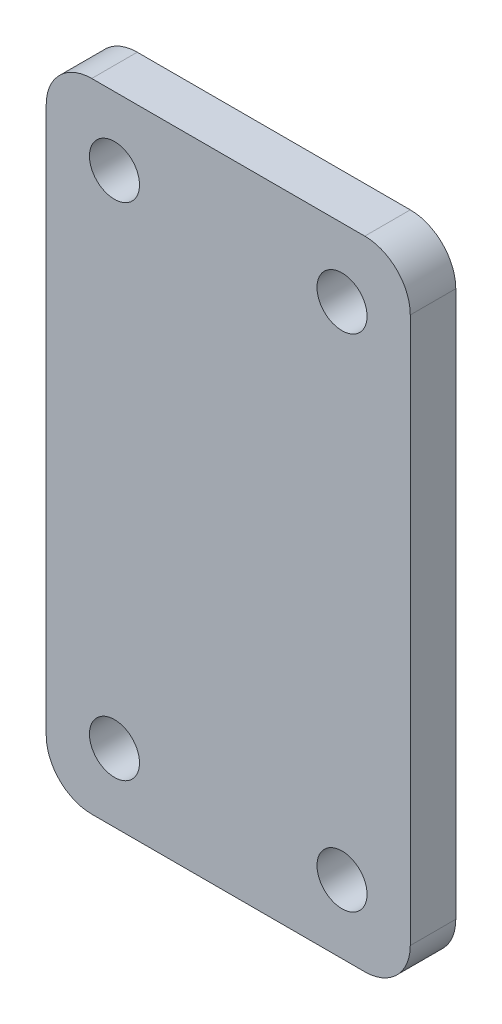
ISO-10303-21;
HEADER;
FILE_DESCRIPTION(('STEP AP214'),'2;1');
FILE_NAME('part.step','',(''),(''),'','','');
FILE_SCHEMA(('AUTOMOTIVE_DESIGN { 1 0 10303 214 1 1 1 1 }'));
ENDSEC;
DATA;
#1=APPLICATION_CONTEXT('core data for automotive mechanical design processes');
#2=APPLICATION_PROTOCOL_DEFINITION('international standard','automotive_design',2000,#1);
#3=PRODUCT_CONTEXT('',#1,'mechanical');
#4=PRODUCT('Part','Part','',(#3));
#5=PRODUCT_RELATED_PRODUCT_CATEGORY('part','',(#4));
#6=PRODUCT_DEFINITION_FORMATION('','',#4);
#7=PRODUCT_DEFINITION_CONTEXT('part definition',#1,'design');
#8=PRODUCT_DEFINITION('design','',#6,#7);
#9=PRODUCT_DEFINITION_SHAPE('','',#8);
#10=(LENGTH_UNIT() NAMED_UNIT(*) SI_UNIT(.MILLI.,.METRE.));
#11=(NAMED_UNIT(*) PLANE_ANGLE_UNIT() SI_UNIT($,.RADIAN.));
#12=(NAMED_UNIT(*) SI_UNIT($,.STERADIAN.) SOLID_ANGLE_UNIT());
#13=UNCERTAINTY_MEASURE_WITH_UNIT(LENGTH_MEASURE(1.E-05),#10,'distance_accuracy_value','');
#14=(GEOMETRIC_REPRESENTATION_CONTEXT(3) GLOBAL_UNCERTAINTY_ASSIGNED_CONTEXT((#13)) GLOBAL_UNIT_ASSIGNED_CONTEXT((#10,
#11,#12)) REPRESENTATION_CONTEXT('',''));
#15=CARTESIAN_POINT('',(0.,0.,0.));
#16=DIRECTION('',(0.,0.,1.));
#17=DIRECTION('',(1.,0.,0.));
#18=AXIS2_PLACEMENT_3D('',#15,#16,#17);
#19=CARTESIAN_POINT('',(40.,70.,-10.));
#20=DIRECTION('',(1.,0.,0.));
#21=DIRECTION('',(0.,1.,0.));
#22=AXIS2_PLACEMENT_3D('',#19,#20,#21);
#23=PLANE('',#22);
#24=DIRECTION('',(0.,1.,0.));
#25=VECTOR('',#24,1.);
#26=CARTESIAN_POINT('',(40.,70.,-10.));
#27=LINE('',#26,#25);
#28=CARTESIAN_POINT('',(40.,-60.,-10.));
#29=VERTEX_POINT('',#28);
#30=CARTESIAN_POINT('',(40.,60.,-10.));
#31=VERTEX_POINT('',#30);
#32=EDGE_CURVE('E196',#29,#31,#27,.T.);
#33=ORIENTED_EDGE('',*,*,#32,.T.);
#34=DIRECTION('',(0.,0.,1.));
#35=VECTOR('',#34,1.);
#36=CARTESIAN_POINT('',(40.,60.,-10.));
#37=LINE('',#36,#35);
#38=CARTESIAN_POINT('',(40.,60.,0.));
#39=VERTEX_POINT('',#38);
#40=EDGE_CURVE('E175',#31,#39,#37,.T.);
#41=ORIENTED_EDGE('',*,*,#40,.T.);
#42=DIRECTION('',(0.,1.,0.));
#43=VECTOR('',#42,1.);
#44=CARTESIAN_POINT('',(40.,70.,0.));
#45=LINE('',#44,#43);
#46=CARTESIAN_POINT('',(40.,-60.,0.));
#47=VERTEX_POINT('',#46);
#48=EDGE_CURVE('E112',#47,#39,#45,.T.);
#49=ORIENTED_EDGE('',*,*,#48,.F.);
#50=DIRECTION('',(0.,0.,1.));
#51=VECTOR('',#50,1.);
#52=CARTESIAN_POINT('',(40.,-60.,-10.));
#53=LINE('',#52,#51);
#54=EDGE_CURVE('E172',#47,#29,#53,.F.);
#55=ORIENTED_EDGE('',*,*,#54,.T.);
#56=EDGE_LOOP('',(#33,#41,#49,#55));
#57=FACE_BOUND('',#56,.T.);
#58=ADVANCED_FACE('F40',(#57),#23,.T.);
#59=CARTESIAN_POINT('',(-40.,-70.,-10.));
#60=DIRECTION('',(0.,-1.,0.));
#61=DIRECTION('',(0.,0.,-1.));
#62=AXIS2_PLACEMENT_3D('',#59,#60,#61);
#63=PLANE('',#62);
#64=DIRECTION('',(1.,0.,0.));
#65=VECTOR('',#64,1.);
#66=CARTESIAN_POINT('',(-40.,-70.,-10.));
#67=LINE('',#66,#65);
#68=CARTESIAN_POINT('',(-30.,-70.,-10.));
#69=VERTEX_POINT('',#68);
#70=CARTESIAN_POINT('',(30.,-70.,-10.));
#71=VERTEX_POINT('',#70);
#72=EDGE_CURVE('E136',#69,#71,#67,.T.);
#73=ORIENTED_EDGE('',*,*,#72,.T.);
#74=DIRECTION('',(0.,0.,1.));
#75=VECTOR('',#74,1.);
#76=CARTESIAN_POINT('',(30.,-70.,-10.));
#77=LINE('',#76,#75);
#78=CARTESIAN_POINT('',(30.,-70.,0.));
#79=VERTEX_POINT('',#78);
#80=EDGE_CURVE('E11',#71,#79,#77,.T.);
#81=ORIENTED_EDGE('',*,*,#80,.T.);
#82=DIRECTION('',(1.,0.,0.));
#83=VECTOR('',#82,1.);
#84=CARTESIAN_POINT('',(-40.,-70.,0.));
#85=LINE('',#84,#83);
#86=CARTESIAN_POINT('',(-30.,-70.,0.));
#87=VERTEX_POINT('',#86);
#88=EDGE_CURVE('E146',#87,#79,#85,.T.);
#89=ORIENTED_EDGE('',*,*,#88,.F.);
#90=DIRECTION('',(0.,0.,1.));
#91=VECTOR('',#90,1.);
#92=CARTESIAN_POINT('',(-30.,-70.,-10.));
#93=LINE('',#92,#91);
#94=EDGE_CURVE('E49',#87,#69,#93,.F.);
#95=ORIENTED_EDGE('',*,*,#94,.T.);
#96=EDGE_LOOP('',(#73,#81,#89,#95));
#97=FACE_BOUND('',#96,.T.);
#98=ADVANCED_FACE('F240',(#97),#63,.T.);
#99=CARTESIAN_POINT('',(-40.,70.,-10.));
#100=DIRECTION('',(-1.,0.,0.));
#101=DIRECTION('',(0.,-1.,0.));
#102=AXIS2_PLACEMENT_3D('',#99,#100,#101);
#103=PLANE('',#102);
#104=DIRECTION('',(0.,-1.,0.));
#105=VECTOR('',#104,1.);
#106=CARTESIAN_POINT('',(-40.,70.,0.));
#107=LINE('',#106,#105);
#108=CARTESIAN_POINT('',(-40.,60.,0.));
#109=VERTEX_POINT('',#108);
#110=CARTESIAN_POINT('',(-40.,-60.,0.));
#111=VERTEX_POINT('',#110);
#112=EDGE_CURVE('E130',#109,#111,#107,.T.);
#113=ORIENTED_EDGE('',*,*,#112,.F.);
#114=DIRECTION('',(0.,0.,1.));
#115=VECTOR('',#114,1.);
#116=CARTESIAN_POINT('',(-40.,60.,-10.));
#117=LINE('',#116,#115);
#118=CARTESIAN_POINT('',(-40.,60.,-10.));
#119=VERTEX_POINT('',#118);
#120=EDGE_CURVE('E159',#109,#119,#117,.F.);
#121=ORIENTED_EDGE('',*,*,#120,.T.);
#122=DIRECTION('',(0.,-1.,0.));
#123=VECTOR('',#122,1.);
#124=CARTESIAN_POINT('',(-40.,70.,-10.));
#125=LINE('',#124,#123);
#126=CARTESIAN_POINT('',(-40.,-60.,-10.));
#127=VERTEX_POINT('',#126);
#128=EDGE_CURVE('E143',#119,#127,#125,.T.);
#129=ORIENTED_EDGE('',*,*,#128,.T.);
#130=DIRECTION('',(0.,0.,1.));
#131=VECTOR('',#130,1.);
#132=CARTESIAN_POINT('',(-40.,-60.,-10.));
#133=LINE('',#132,#131);
#134=EDGE_CURVE('E155',#127,#111,#133,.T.);
#135=ORIENTED_EDGE('',*,*,#134,.T.);
#136=EDGE_LOOP('',(#113,#121,#129,#135));
#137=FACE_BOUND('',#136,.T.);
#138=ADVANCED_FACE('F219',(#137),#103,.T.);
#139=CARTESIAN_POINT('',(-40.,70.,-10.));
#140=DIRECTION('',(0.,1.,0.));
#141=DIRECTION('',(0.,0.,1.));
#142=AXIS2_PLACEMENT_3D('',#139,#140,#141);
#143=PLANE('',#142);
#144=DIRECTION('',(-1.,0.,0.));
#145=VECTOR('',#144,1.);
#146=CARTESIAN_POINT('',(-40.,70.,-10.));
#147=LINE('',#146,#145);
#148=CARTESIAN_POINT('',(30.,70.,-10.));
#149=VERTEX_POINT('',#148);
#150=CARTESIAN_POINT('',(-30.,70.,-10.));
#151=VERTEX_POINT('',#150);
#152=EDGE_CURVE('E198',#149,#151,#147,.T.);
#153=ORIENTED_EDGE('',*,*,#152,.T.);
#154=DIRECTION('',(0.,0.,1.));
#155=VECTOR('',#154,1.);
#156=CARTESIAN_POINT('',(-30.,70.,-10.));
#157=LINE('',#156,#155);
#158=CARTESIAN_POINT('',(-30.,70.,0.));
#159=VERTEX_POINT('',#158);
#160=EDGE_CURVE('E128',#151,#159,#157,.T.);
#161=ORIENTED_EDGE('',*,*,#160,.T.);
#162=DIRECTION('',(-1.,0.,0.));
#163=VECTOR('',#162,1.);
#164=CARTESIAN_POINT('',(-40.,70.,0.));
#165=LINE('',#164,#163);
#166=CARTESIAN_POINT('',(30.,70.,0.));
#167=VERTEX_POINT('',#166);
#168=EDGE_CURVE('E110',#167,#159,#165,.T.);
#169=ORIENTED_EDGE('',*,*,#168,.F.);
#170=DIRECTION('',(0.,0.,1.));
#171=VECTOR('',#170,1.);
#172=CARTESIAN_POINT('',(30.,70.,-10.));
#173=LINE('',#172,#171);
#174=EDGE_CURVE('E125',#167,#149,#173,.F.);
#175=ORIENTED_EDGE('',*,*,#174,.T.);
#176=EDGE_LOOP('',(#153,#161,#169,#175));
#177=FACE_BOUND('',#176,.T.);
#178=ADVANCED_FACE('F124',(#177),#143,.T.);
#179=CARTESIAN_POINT('',(0.,0.,-10.));
#180=DIRECTION('',(0.,0.,1.));
#181=DIRECTION('',(1.,0.,0.));
#182=AXIS2_PLACEMENT_3D('',#179,#180,#181);
#183=PLANE('',#182);
#184=CARTESIAN_POINT('',(25.,-55.,-10.));
#185=DIRECTION('',(0.,0.,1.));
#186=DIRECTION('',(1.,0.,0.));
#187=AXIS2_PLACEMENT_3D('',#184,#185,#186);
#188=CIRCLE('',#187,5.5);
#189=CARTESIAN_POINT('',(30.5,-55.,-10.));
#190=VERTEX_POINT('',#189);
#191=EDGE_CURVE('E206',#190,#190,#188,.T.);
#192=ORIENTED_EDGE('',*,*,#191,.T.);
#193=EDGE_LOOP('',(#192));
#194=FACE_BOUND('',#193,.T.);
#195=CARTESIAN_POINT('',(-25.,-55.,-10.));
#196=DIRECTION('',(0.,0.,1.));
#197=DIRECTION('',(1.,0.,0.));
#198=AXIS2_PLACEMENT_3D('',#195,#196,#197);
#199=CIRCLE('',#198,5.5);
#200=CARTESIAN_POINT('',(-19.5,-55.,-10.));
#201=VERTEX_POINT('',#200);
#202=EDGE_CURVE('E397',#201,#201,#199,.T.);
#203=ORIENTED_EDGE('',*,*,#202,.T.);
#204=EDGE_LOOP('',(#203));
#205=FACE_BOUND('',#204,.T.);
#206=CARTESIAN_POINT('',(-25.,55.,-10.));
#207=DIRECTION('',(0.,0.,1.));
#208=DIRECTION('',(1.,0.,0.));
#209=AXIS2_PLACEMENT_3D('',#206,#207,#208);
#210=CIRCLE('',#209,5.5);
#211=CARTESIAN_POINT('',(-19.5,55.,-10.));
#212=VERTEX_POINT('',#211);
#213=EDGE_CURVE('E401',#212,#212,#210,.T.);
#214=ORIENTED_EDGE('',*,*,#213,.T.);
#215=EDGE_LOOP('',(#214));
#216=FACE_BOUND('',#215,.T.);
#217=CARTESIAN_POINT('',(25.,55.,-10.));
#218=DIRECTION('',(0.,0.,1.));
#219=DIRECTION('',(1.,0.,0.));
#220=AXIS2_PLACEMENT_3D('',#217,#218,#219);
#221=CIRCLE('',#220,5.5);
#222=CARTESIAN_POINT('',(30.5,55.,-10.));
#223=VERTEX_POINT('',#222);
#224=EDGE_CURVE('E404',#223,#223,#221,.T.);
#225=ORIENTED_EDGE('',*,*,#224,.T.);
#226=EDGE_LOOP('',(#225));
#227=FACE_BOUND('',#226,.T.);
#228=ORIENTED_EDGE('',*,*,#128,.F.);
#229=CARTESIAN_POINT('',(-30.,60.,-10.));
#230=DIRECTION('',(0.,0.,1.));
#231=DIRECTION('',(1.,0.,0.));
#232=AXIS2_PLACEMENT_3D('',#229,#230,#231);
#233=CIRCLE('',#232,10.);
#234=EDGE_CURVE('E169',#119,#151,#233,.F.);
#235=ORIENTED_EDGE('',*,*,#234,.T.);
#236=ORIENTED_EDGE('',*,*,#152,.F.);
#237=CARTESIAN_POINT('',(30.,60.,-10.));
#238=DIRECTION('',(0.,0.,1.));
#239=DIRECTION('',(1.,0.,0.));
#240=AXIS2_PLACEMENT_3D('',#237,#238,#239);
#241=CIRCLE('',#240,10.);
#242=EDGE_CURVE('E134',#149,#31,#241,.F.);
#243=ORIENTED_EDGE('',*,*,#242,.T.);
#244=ORIENTED_EDGE('',*,*,#32,.F.);
#245=CARTESIAN_POINT('',(30.,-60.,-10.));
#246=DIRECTION('',(0.,0.,1.));
#247=DIRECTION('',(1.,0.,0.));
#248=AXIS2_PLACEMENT_3D('',#245,#246,#247);
#249=CIRCLE('',#248,10.);
#250=EDGE_CURVE('E56',#29,#71,#249,.F.);
#251=ORIENTED_EDGE('',*,*,#250,.T.);
#252=ORIENTED_EDGE('',*,*,#72,.F.);
#253=CARTESIAN_POINT('',(-30.,-60.,-10.));
#254=DIRECTION('',(0.,0.,1.));
#255=DIRECTION('',(1.,0.,0.));
#256=AXIS2_PLACEMENT_3D('',#253,#254,#255);
#257=CIRCLE('',#256,10.);
#258=EDGE_CURVE('E162',#69,#127,#257,.F.);
#259=ORIENTED_EDGE('',*,*,#258,.T.);
#260=EDGE_LOOP('',(#228,#235,#236,#243,#244,#251,#252,#259));
#261=FACE_BOUND('',#260,.T.);
#262=ADVANCED_FACE('F225',(#194,#205,#216,#227,#261),#183,.F.);
#263=CARTESIAN_POINT('',(0.,0.,0.));
#264=DIRECTION('',(0.,0.,1.));
#265=DIRECTION('',(1.,0.,0.));
#266=AXIS2_PLACEMENT_3D('',#263,#264,#265);
#267=PLANE('',#266);
#268=CARTESIAN_POINT('',(25.,-55.,0.));
#269=DIRECTION('',(0.,0.,1.));
#270=DIRECTION('',(1.,0.,0.));
#271=AXIS2_PLACEMENT_3D('',#268,#269,#270);
#272=CIRCLE('',#271,5.5);
#273=CARTESIAN_POINT('',(30.5,-55.,0.));
#274=VERTEX_POINT('',#273);
#275=EDGE_CURVE('E424',#274,#274,#272,.T.);
#276=ORIENTED_EDGE('',*,*,#275,.F.);
#277=EDGE_LOOP('',(#276));
#278=FACE_BOUND('',#277,.T.);
#279=CARTESIAN_POINT('',(-25.,-55.,0.));
#280=DIRECTION('',(0.,0.,1.));
#281=DIRECTION('',(1.,0.,0.));
#282=AXIS2_PLACEMENT_3D('',#279,#280,#281);
#283=CIRCLE('',#282,5.5);
#284=CARTESIAN_POINT('',(-19.5,-55.,0.));
#285=VERTEX_POINT('',#284);
#286=EDGE_CURVE('E428',#285,#285,#283,.T.);
#287=ORIENTED_EDGE('',*,*,#286,.F.);
#288=EDGE_LOOP('',(#287));
#289=FACE_BOUND('',#288,.T.);
#290=CARTESIAN_POINT('',(-25.,55.,0.));
#291=DIRECTION('',(0.,0.,1.));
#292=DIRECTION('',(1.,0.,0.));
#293=AXIS2_PLACEMENT_3D('',#290,#291,#292);
#294=CIRCLE('',#293,5.5);
#295=CARTESIAN_POINT('',(-19.5,55.,0.));
#296=VERTEX_POINT('',#295);
#297=EDGE_CURVE('E414',#296,#296,#294,.T.);
#298=ORIENTED_EDGE('',*,*,#297,.F.);
#299=EDGE_LOOP('',(#298));
#300=FACE_BOUND('',#299,.T.);
#301=CARTESIAN_POINT('',(25.,55.,0.));
#302=DIRECTION('',(0.,0.,1.));
#303=DIRECTION('',(1.,0.,0.));
#304=AXIS2_PLACEMENT_3D('',#301,#302,#303);
#305=CIRCLE('',#304,5.5);
#306=CARTESIAN_POINT('',(30.5,55.,0.));
#307=VERTEX_POINT('',#306);
#308=EDGE_CURVE('E407',#307,#307,#305,.T.);
#309=ORIENTED_EDGE('',*,*,#308,.F.);
#310=EDGE_LOOP('',(#309));
#311=FACE_BOUND('',#310,.T.);
#312=ORIENTED_EDGE('',*,*,#168,.T.);
#313=CARTESIAN_POINT('',(-30.,60.,0.));
#314=DIRECTION('',(0.,0.,1.));
#315=DIRECTION('',(1.,0.,0.));
#316=AXIS2_PLACEMENT_3D('',#313,#314,#315);
#317=CIRCLE('',#316,10.);
#318=EDGE_CURVE('E118',#159,#109,#317,.T.);
#319=ORIENTED_EDGE('',*,*,#318,.T.);
#320=ORIENTED_EDGE('',*,*,#112,.T.);
#321=CARTESIAN_POINT('',(-30.,-60.,0.));
#322=DIRECTION('',(0.,0.,1.));
#323=DIRECTION('',(1.,0.,0.));
#324=AXIS2_PLACEMENT_3D('',#321,#322,#323);
#325=CIRCLE('',#324,10.);
#326=EDGE_CURVE('E141',#111,#87,#325,.T.);
#327=ORIENTED_EDGE('',*,*,#326,.T.);
#328=ORIENTED_EDGE('',*,*,#88,.T.);
#329=CARTESIAN_POINT('',(30.,-60.,0.));
#330=DIRECTION('',(0.,0.,1.));
#331=DIRECTION('',(1.,0.,0.));
#332=AXIS2_PLACEMENT_3D('',#329,#330,#331);
#333=CIRCLE('',#332,10.);
#334=EDGE_CURVE('E119',#79,#47,#333,.T.);
#335=ORIENTED_EDGE('',*,*,#334,.T.);
#336=ORIENTED_EDGE('',*,*,#48,.T.);
#337=CARTESIAN_POINT('',(30.,60.,0.));
#338=DIRECTION('',(0.,0.,1.));
#339=DIRECTION('',(1.,0.,0.));
#340=AXIS2_PLACEMENT_3D('',#337,#338,#339);
#341=CIRCLE('',#340,10.);
#342=EDGE_CURVE('E107',#39,#167,#341,.T.);
#343=ORIENTED_EDGE('',*,*,#342,.T.);
#344=EDGE_LOOP('',(#312,#319,#320,#327,#328,#335,#336,#343));
#345=FACE_BOUND('',#344,.T.);
#346=ADVANCED_FACE('F109',(#278,#289,#300,#311,#345),#267,.T.);
#347=CARTESIAN_POINT('',(-30.,60.,-10.));
#348=DIRECTION('',(0.,0.,1.));
#349=DIRECTION('',(1.,0.,0.));
#350=AXIS2_PLACEMENT_3D('',#347,#348,#349);
#351=CYLINDRICAL_SURFACE('',#350,10.);
#352=ORIENTED_EDGE('',*,*,#234,.F.);
#353=ORIENTED_EDGE('',*,*,#120,.F.);
#354=ORIENTED_EDGE('',*,*,#318,.F.);
#355=ORIENTED_EDGE('',*,*,#160,.F.);
#356=EDGE_LOOP('',(#352,#353,#354,#355));
#357=FACE_BOUND('',#356,.T.);
#358=ADVANCED_FACE('F224',(#357),#351,.T.);
#359=CARTESIAN_POINT('',(30.,60.,-10.));
#360=DIRECTION('',(0.,0.,1.));
#361=DIRECTION('',(1.,0.,0.));
#362=AXIS2_PLACEMENT_3D('',#359,#360,#361);
#363=CYLINDRICAL_SURFACE('',#362,10.);
#364=ORIENTED_EDGE('',*,*,#242,.F.);
#365=ORIENTED_EDGE('',*,*,#174,.F.);
#366=ORIENTED_EDGE('',*,*,#342,.F.);
#367=ORIENTED_EDGE('',*,*,#40,.F.);
#368=EDGE_LOOP('',(#364,#365,#366,#367));
#369=FACE_BOUND('',#368,.T.);
#370=ADVANCED_FACE('F133',(#369),#363,.T.);
#371=CARTESIAN_POINT('',(30.,-60.,-10.));
#372=DIRECTION('',(0.,0.,1.));
#373=DIRECTION('',(1.,0.,0.));
#374=AXIS2_PLACEMENT_3D('',#371,#372,#373);
#375=CYLINDRICAL_SURFACE('',#374,10.);
#376=ORIENTED_EDGE('',*,*,#250,.F.);
#377=ORIENTED_EDGE('',*,*,#54,.F.);
#378=ORIENTED_EDGE('',*,*,#334,.F.);
#379=ORIENTED_EDGE('',*,*,#80,.F.);
#380=EDGE_LOOP('',(#376,#377,#378,#379));
#381=FACE_BOUND('',#380,.T.);
#382=ADVANCED_FACE('F230',(#381),#375,.T.);
#383=CARTESIAN_POINT('',(-30.,-60.,-10.));
#384=DIRECTION('',(0.,0.,1.));
#385=DIRECTION('',(1.,0.,0.));
#386=AXIS2_PLACEMENT_3D('',#383,#384,#385);
#387=CYLINDRICAL_SURFACE('',#386,10.);
#388=ORIENTED_EDGE('',*,*,#258,.F.);
#389=ORIENTED_EDGE('',*,*,#94,.F.);
#390=ORIENTED_EDGE('',*,*,#326,.F.);
#391=ORIENTED_EDGE('',*,*,#134,.F.);
#392=EDGE_LOOP('',(#388,#389,#390,#391));
#393=FACE_BOUND('',#392,.T.);
#394=ADVANCED_FACE('F42',(#393),#387,.T.);
#395=CARTESIAN_POINT('',(25.,55.,-20.));
#396=DIRECTION('',(0.,0.,1.));
#397=DIRECTION('',(1.,0.,0.));
#398=AXIS2_PLACEMENT_3D('',#395,#396,#397);
#399=CYLINDRICAL_SURFACE('',#398,5.5);
#400=ORIENTED_EDGE('',*,*,#308,.T.);
#401=EDGE_LOOP('',(#400));
#402=FACE_BOUND('',#401,.T.);
#403=ORIENTED_EDGE('',*,*,#224,.F.);
#404=EDGE_LOOP('',(#403));
#405=FACE_BOUND('',#404,.T.);
#406=ADVANCED_FACE('F229',(#402,#405),#399,.F.);
#407=CARTESIAN_POINT('',(-25.,55.,-20.));
#408=DIRECTION('',(0.,0.,1.));
#409=DIRECTION('',(1.,0.,0.));
#410=AXIS2_PLACEMENT_3D('',#407,#408,#409);
#411=CYLINDRICAL_SURFACE('',#410,5.5);
#412=ORIENTED_EDGE('',*,*,#297,.T.);
#413=EDGE_LOOP('',(#412));
#414=FACE_BOUND('',#413,.T.);
#415=ORIENTED_EDGE('',*,*,#213,.F.);
#416=EDGE_LOOP('',(#415));
#417=FACE_BOUND('',#416,.T.);
#418=ADVANCED_FACE('F235',(#414,#417),#411,.F.);
#419=CARTESIAN_POINT('',(-25.,-55.,-20.));
#420=DIRECTION('',(0.,0.,1.));
#421=DIRECTION('',(1.,0.,0.));
#422=AXIS2_PLACEMENT_3D('',#419,#420,#421);
#423=CYLINDRICAL_SURFACE('',#422,5.5);
#424=ORIENTED_EDGE('',*,*,#286,.T.);
#425=EDGE_LOOP('',(#424));
#426=FACE_BOUND('',#425,.T.);
#427=ORIENTED_EDGE('',*,*,#202,.F.);
#428=EDGE_LOOP('',(#427));
#429=FACE_BOUND('',#428,.T.);
#430=ADVANCED_FACE('F280',(#426,#429),#423,.F.);
#431=CARTESIAN_POINT('',(25.,-55.,-20.));
#432=DIRECTION('',(0.,0.,1.));
#433=DIRECTION('',(1.,0.,0.));
#434=AXIS2_PLACEMENT_3D('',#431,#432,#433);
#435=CYLINDRICAL_SURFACE('',#434,5.5);
#436=ORIENTED_EDGE('',*,*,#275,.T.);
#437=EDGE_LOOP('',(#436));
#438=FACE_BOUND('',#437,.T.);
#439=ORIENTED_EDGE('',*,*,#191,.F.);
#440=EDGE_LOOP('',(#439));
#441=FACE_BOUND('',#440,.T.);
#442=ADVANCED_FACE('F290',(#438,#441),#435,.F.);
#443=CLOSED_SHELL('',(#58,#98,#138,#178,#262,#346,#358,#370,#382,#394,#406,#418,#430,#442));
#444=MANIFOLD_SOLID_BREP('B2',#443);
#445=ADVANCED_BREP_SHAPE_REPRESENTATION('',(#18,#444),#14);
#446=SHAPE_DEFINITION_REPRESENTATION(#9,#445);
ENDSEC;
END-ISO-10303-21;
